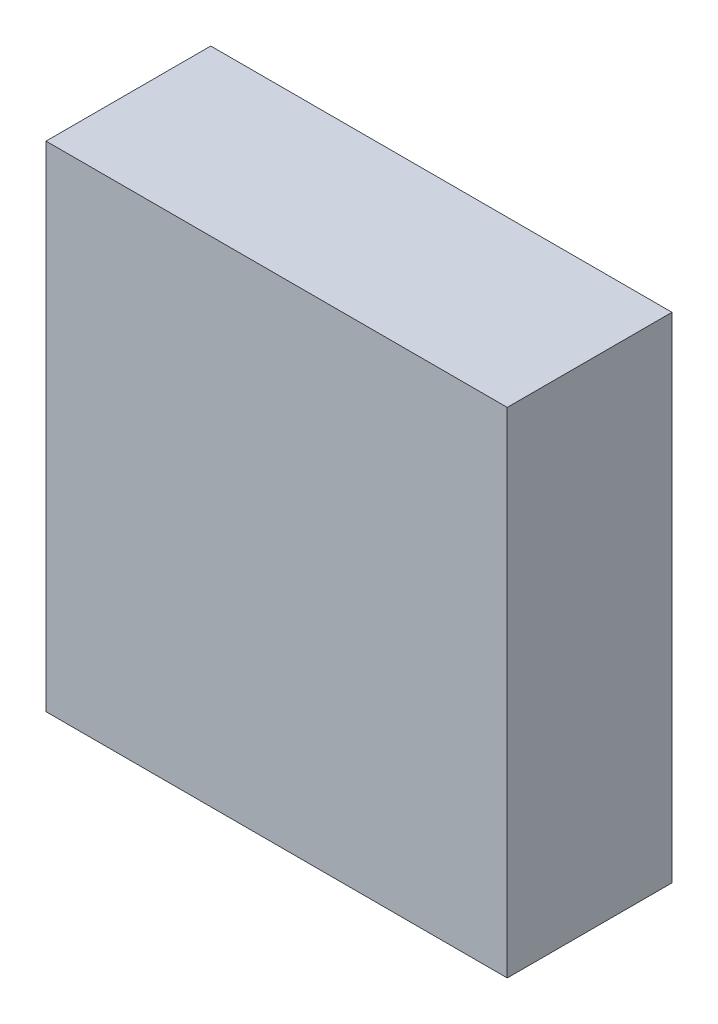
ISO-10303-21;
HEADER;
FILE_DESCRIPTION(('STEP AP214'),'2;1');
FILE_NAME('part.step','',(''),(''),'','','');
FILE_SCHEMA(('AUTOMOTIVE_DESIGN { 1 0 10303 214 1 1 1 1 }'));
ENDSEC;
DATA;
#1=APPLICATION_CONTEXT('core data for automotive mechanical design processes');
#2=APPLICATION_PROTOCOL_DEFINITION('international standard','automotive_design',2000,#1);
#3=PRODUCT_CONTEXT('',#1,'mechanical');
#4=PRODUCT('Part','Part','',(#3));
#5=PRODUCT_RELATED_PRODUCT_CATEGORY('part','',(#4));
#6=PRODUCT_DEFINITION_FORMATION('','',#4);
#7=PRODUCT_DEFINITION_CONTEXT('part definition',#1,'design');
#8=PRODUCT_DEFINITION('design','',#6,#7);
#9=PRODUCT_DEFINITION_SHAPE('','',#8);
#10=(LENGTH_UNIT() NAMED_UNIT(*) SI_UNIT(.MILLI.,.METRE.));
#11=(NAMED_UNIT(*) PLANE_ANGLE_UNIT() SI_UNIT($,.RADIAN.));
#12=(NAMED_UNIT(*) SI_UNIT($,.STERADIAN.) SOLID_ANGLE_UNIT());
#13=UNCERTAINTY_MEASURE_WITH_UNIT(LENGTH_MEASURE(1.E-05),#10,'distance_accuracy_value','');
#14=(GEOMETRIC_REPRESENTATION_CONTEXT(3) GLOBAL_UNCERTAINTY_ASSIGNED_CONTEXT((#13)) GLOBAL_UNIT_ASSIGNED_CONTEXT((#10,
#11,#12)) REPRESENTATION_CONTEXT('',''));
#15=CARTESIAN_POINT('',(0.,0.,0.));
#16=DIRECTION('',(0.,0.,1.));
#17=DIRECTION('',(1.,0.,0.));
#18=AXIS2_PLACEMENT_3D('',#15,#16,#17);
#19=CARTESIAN_POINT('',(-1.4,-1.5,1.));
#20=DIRECTION('',(1.,0.,0.));
#21=DIRECTION('',(0.,0.,-1.));
#22=AXIS2_PLACEMENT_3D('',#19,#20,#21);
#23=PLANE('',#22);
#24=DIRECTION('',(0.,-1.,0.));
#25=VECTOR('',#24,1.);
#26=CARTESIAN_POINT('',(-1.4,-1.5,0.));
#27=LINE('',#26,#25);
#28=CARTESIAN_POINT('',(-1.4,1.5,0.));
#29=VERTEX_POINT('',#28);
#30=CARTESIAN_POINT('',(-1.4,-1.5,0.));
#31=VERTEX_POINT('',#30);
#32=EDGE_CURVE('E95',#29,#31,#27,.T.);
#33=ORIENTED_EDGE('',*,*,#32,.T.);
#34=DIRECTION('',(0.,0.,-1.));
#35=VECTOR('',#34,1.);
#36=CARTESIAN_POINT('',(-1.4,-1.5,1.));
#37=LINE('',#36,#35);
#38=CARTESIAN_POINT('',(-1.4,-1.5,1.));
#39=VERTEX_POINT('',#38);
#40=EDGE_CURVE('E11',#39,#31,#37,.T.);
#41=ORIENTED_EDGE('',*,*,#40,.F.);
#42=DIRECTION('',(0.,-1.,0.));
#43=VECTOR('',#42,1.);
#44=CARTESIAN_POINT('',(-1.4,-1.5,1.));
#45=LINE('',#44,#43);
#46=CARTESIAN_POINT('',(-1.4,1.5,1.));
#47=VERTEX_POINT('',#46);
#48=EDGE_CURVE('E83',#47,#39,#45,.T.);
#49=ORIENTED_EDGE('',*,*,#48,.F.);
#50=DIRECTION('',(0.,0.,-1.));
#51=VECTOR('',#50,1.);
#52=CARTESIAN_POINT('',(-1.4,1.5,1.));
#53=LINE('',#52,#51);
#54=EDGE_CURVE('E91',#47,#29,#53,.T.);
#55=ORIENTED_EDGE('',*,*,#54,.T.);
#56=EDGE_LOOP('',(#33,#41,#49,#55));
#57=FACE_BOUND('',#56,.T.);
#58=ADVANCED_FACE('F32',(#57),#23,.F.);
#59=CARTESIAN_POINT('',(1.4,-1.5,1.));
#60=DIRECTION('',(0.,1.,0.));
#61=DIRECTION('',(0.,0.,1.));
#62=AXIS2_PLACEMENT_3D('',#59,#60,#61);
#63=PLANE('',#62);
#64=DIRECTION('',(1.,0.,0.));
#65=VECTOR('',#64,1.);
#66=CARTESIAN_POINT('',(1.4,-1.5,0.));
#67=LINE('',#66,#65);
#68=CARTESIAN_POINT('',(1.4,-1.5,0.));
#69=VERTEX_POINT('',#68);
#70=EDGE_CURVE('E87',#31,#69,#67,.T.);
#71=ORIENTED_EDGE('',*,*,#70,.T.);
#72=DIRECTION('',(0.,0.,-1.));
#73=VECTOR('',#72,1.);
#74=CARTESIAN_POINT('',(1.4,-1.5,1.));
#75=LINE('',#74,#73);
#76=CARTESIAN_POINT('',(1.4,-1.5,1.));
#77=VERTEX_POINT('',#76);
#78=EDGE_CURVE('E40',#77,#69,#75,.T.);
#79=ORIENTED_EDGE('',*,*,#78,.F.);
#80=DIRECTION('',(1.,0.,0.));
#81=VECTOR('',#80,1.);
#82=CARTESIAN_POINT('',(1.4,-1.5,1.));
#83=LINE('',#82,#81);
#84=EDGE_CURVE('E78',#39,#77,#83,.T.);
#85=ORIENTED_EDGE('',*,*,#84,.F.);
#86=ORIENTED_EDGE('',*,*,#40,.T.);
#87=EDGE_LOOP('',(#71,#79,#85,#86));
#88=FACE_BOUND('',#87,.T.);
#89=ADVANCED_FACE('F86',(#88),#63,.F.);
#90=CARTESIAN_POINT('',(1.4,1.5,1.));
#91=DIRECTION('',(-1.,0.,0.));
#92=DIRECTION('',(0.,0.,1.));
#93=AXIS2_PLACEMENT_3D('',#90,#91,#92);
#94=PLANE('',#93);
#95=DIRECTION('',(0.,1.,0.));
#96=VECTOR('',#95,1.);
#97=CARTESIAN_POINT('',(1.4,1.5,0.));
#98=LINE('',#97,#96);
#99=CARTESIAN_POINT('',(1.4,1.5,0.));
#100=VERTEX_POINT('',#99);
#101=EDGE_CURVE('E65',#69,#100,#98,.T.);
#102=ORIENTED_EDGE('',*,*,#101,.T.);
#103=DIRECTION('',(0.,0.,-1.));
#104=VECTOR('',#103,1.);
#105=CARTESIAN_POINT('',(1.4,1.5,1.));
#106=LINE('',#105,#104);
#107=CARTESIAN_POINT('',(1.4,1.5,1.));
#108=VERTEX_POINT('',#107);
#109=EDGE_CURVE('E88',#108,#100,#106,.T.);
#110=ORIENTED_EDGE('',*,*,#109,.F.);
#111=DIRECTION('',(0.,1.,0.));
#112=VECTOR('',#111,1.);
#113=CARTESIAN_POINT('',(1.4,1.5,1.));
#114=LINE('',#113,#112);
#115=EDGE_CURVE('E81',#77,#108,#114,.T.);
#116=ORIENTED_EDGE('',*,*,#115,.F.);
#117=ORIENTED_EDGE('',*,*,#78,.T.);
#118=EDGE_LOOP('',(#102,#110,#116,#117));
#119=FACE_BOUND('',#118,.T.);
#120=ADVANCED_FACE('F89',(#119),#94,.F.);
#121=CARTESIAN_POINT('',(-1.4,1.5,1.));
#122=DIRECTION('',(0.,-1.,0.));
#123=DIRECTION('',(0.,0.,-1.));
#124=AXIS2_PLACEMENT_3D('',#121,#122,#123);
#125=PLANE('',#124);
#126=DIRECTION('',(-1.,0.,0.));
#127=VECTOR('',#126,1.);
#128=CARTESIAN_POINT('',(-1.4,1.5,0.));
#129=LINE('',#128,#127);
#130=EDGE_CURVE('E71',#100,#29,#129,.T.);
#131=ORIENTED_EDGE('',*,*,#130,.T.);
#132=ORIENTED_EDGE('',*,*,#54,.F.);
#133=DIRECTION('',(-1.,0.,0.));
#134=VECTOR('',#133,1.);
#135=CARTESIAN_POINT('',(-1.4,1.5,1.));
#136=LINE('',#135,#134);
#137=EDGE_CURVE('E48',#108,#47,#136,.T.);
#138=ORIENTED_EDGE('',*,*,#137,.F.);
#139=ORIENTED_EDGE('',*,*,#109,.T.);
#140=EDGE_LOOP('',(#131,#132,#138,#139));
#141=FACE_BOUND('',#140,.T.);
#142=ADVANCED_FACE('F102',(#141),#125,.F.);
#143=CARTESIAN_POINT('',(0.,0.,1.));
#144=DIRECTION('',(0.,0.,-1.));
#145=DIRECTION('',(-1.,0.,0.));
#146=AXIS2_PLACEMENT_3D('',#143,#144,#145);
#147=PLANE('',#146);
#148=ORIENTED_EDGE('',*,*,#48,.T.);
#149=ORIENTED_EDGE('',*,*,#84,.T.);
#150=ORIENTED_EDGE('',*,*,#115,.T.);
#151=ORIENTED_EDGE('',*,*,#137,.T.);
#152=EDGE_LOOP('',(#148,#149,#150,#151));
#153=FACE_BOUND('',#152,.T.);
#154=ADVANCED_FACE('F79',(#153),#147,.F.);
#155=CARTESIAN_POINT('',(0.,0.,0.));
#156=DIRECTION('',(0.,0.,-1.));
#157=DIRECTION('',(-1.,0.,0.));
#158=AXIS2_PLACEMENT_3D('',#155,#156,#157);
#159=PLANE('',#158);
#160=ORIENTED_EDGE('',*,*,#32,.F.);
#161=ORIENTED_EDGE('',*,*,#130,.F.);
#162=ORIENTED_EDGE('',*,*,#101,.F.);
#163=ORIENTED_EDGE('',*,*,#70,.F.);
#164=EDGE_LOOP('',(#160,#161,#162,#163));
#165=FACE_BOUND('',#164,.T.);
#166=ADVANCED_FACE('F105',(#165),#159,.T.);
#167=CLOSED_SHELL('',(#58,#89,#120,#142,#154,#166));
#168=MANIFOLD_SOLID_BREP('B2',#167);
#169=ADVANCED_BREP_SHAPE_REPRESENTATION('',(#18,#168),#14);
#170=SHAPE_DEFINITION_REPRESENTATION(#9,#169);
ENDSEC;
END-ISO-10303-21;
